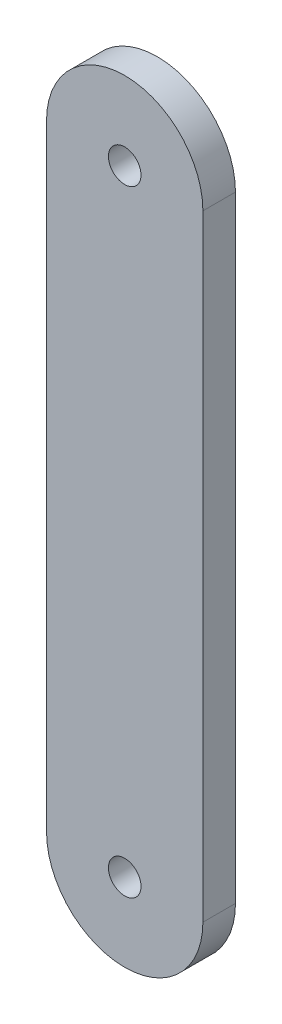
ISO-10303-21;
HEADER;
FILE_DESCRIPTION(('STEP AP214'),'2;1');
FILE_NAME('part.step','',(''),(''),'','','');
FILE_SCHEMA(('AUTOMOTIVE_DESIGN { 1 0 10303 214 1 1 1 1 }'));
ENDSEC;
DATA;
#1=APPLICATION_CONTEXT('core data for automotive mechanical design processes');
#2=APPLICATION_PROTOCOL_DEFINITION('international standard','automotive_design',2000,#1);
#3=PRODUCT_CONTEXT('',#1,'mechanical');
#4=PRODUCT('Part','Part','',(#3));
#5=PRODUCT_RELATED_PRODUCT_CATEGORY('part','',(#4));
#6=PRODUCT_DEFINITION_FORMATION('','',#4);
#7=PRODUCT_DEFINITION_CONTEXT('part definition',#1,'design');
#8=PRODUCT_DEFINITION('design','',#6,#7);
#9=PRODUCT_DEFINITION_SHAPE('','',#8);
#10=(LENGTH_UNIT() NAMED_UNIT(*) SI_UNIT(.MILLI.,.METRE.));
#11=(NAMED_UNIT(*) PLANE_ANGLE_UNIT() SI_UNIT($,.RADIAN.));
#12=(NAMED_UNIT(*) SI_UNIT($,.STERADIAN.) SOLID_ANGLE_UNIT());
#13=UNCERTAINTY_MEASURE_WITH_UNIT(LENGTH_MEASURE(1.E-05),#10,'distance_accuracy_value','');
#14=(GEOMETRIC_REPRESENTATION_CONTEXT(3) GLOBAL_UNCERTAINTY_ASSIGNED_CONTEXT((#13)) GLOBAL_UNIT_ASSIGNED_CONTEXT((#10,
#11,#12)) REPRESENTATION_CONTEXT('',''));
#15=CARTESIAN_POINT('',(0.,0.,0.));
#16=DIRECTION('',(0.,0.,1.));
#17=DIRECTION('',(1.,0.,0.));
#18=AXIS2_PLACEMENT_3D('',#15,#16,#17);
#19=CARTESIAN_POINT('',(0.,-47.2800000000001,0.));
#20=DIRECTION('',(0.,0.,1.));
#21=DIRECTION('',(1.,0.,0.));
#22=AXIS2_PLACEMENT_3D('',#19,#20,#21);
#23=CYLINDRICAL_SURFACE('',#22,12.);
#24=CARTESIAN_POINT('',(0.,-47.2800000000001,5.));
#25=DIRECTION('',(0.,0.,1.));
#26=DIRECTION('',(1.,0.,0.));
#27=AXIS2_PLACEMENT_3D('',#24,#25,#26);
#28=CIRCLE('',#27,12.);
#29=CARTESIAN_POINT('',(-12.,-47.28,5.));
#30=VERTEX_POINT('',#29);
#31=CARTESIAN_POINT('',(12.,-47.28,5.));
#32=VERTEX_POINT('',#31);
#33=EDGE_CURVE('E99',#30,#32,#28,.T.);
#34=ORIENTED_EDGE('',*,*,#33,.F.);
#35=DIRECTION('',(0.,0.,1.));
#36=VECTOR('',#35,1.);
#37=CARTESIAN_POINT('',(-12.,-47.28,0.));
#38=LINE('',#37,#36);
#39=CARTESIAN_POINT('',(-12.,-47.28,0.));
#40=VERTEX_POINT('',#39);
#41=EDGE_CURVE('E11',#40,#30,#38,.T.);
#42=ORIENTED_EDGE('',*,*,#41,.F.);
#43=CARTESIAN_POINT('',(0.,-47.2800000000001,0.));
#44=DIRECTION('',(0.,0.,1.));
#45=DIRECTION('',(1.,0.,0.));
#46=AXIS2_PLACEMENT_3D('',#43,#44,#45);
#47=CIRCLE('',#46,12.);
#48=CARTESIAN_POINT('',(12.,-47.28,0.));
#49=VERTEX_POINT('',#48);
#50=EDGE_CURVE('E92',#40,#49,#47,.T.);
#51=ORIENTED_EDGE('',*,*,#50,.T.);
#52=DIRECTION('',(0.,0.,1.));
#53=VECTOR('',#52,1.);
#54=CARTESIAN_POINT('',(12.,-47.28,0.));
#55=LINE('',#54,#53);
#56=EDGE_CURVE('E37',#49,#32,#55,.T.);
#57=ORIENTED_EDGE('',*,*,#56,.T.);
#58=EDGE_LOOP('',(#34,#42,#51,#57));
#59=FACE_BOUND('',#58,.T.);
#60=ADVANCED_FACE('F34',(#59),#23,.T.);
#61=CARTESIAN_POINT('',(-12.,47.28,0.));
#62=DIRECTION('',(-1.,0.,0.));
#63=DIRECTION('',(0.,0.,1.));
#64=AXIS2_PLACEMENT_3D('',#61,#62,#63);
#65=PLANE('',#64);
#66=DIRECTION('',(0.,-1.,0.));
#67=VECTOR('',#66,1.);
#68=CARTESIAN_POINT('',(-12.,47.28,5.));
#69=LINE('',#68,#67);
#70=CARTESIAN_POINT('',(-12.,47.28,5.));
#71=VERTEX_POINT('',#70);
#72=EDGE_CURVE('E94',#71,#30,#69,.T.);
#73=ORIENTED_EDGE('',*,*,#72,.F.);
#74=DIRECTION('',(0.,0.,1.));
#75=VECTOR('',#74,1.);
#76=CARTESIAN_POINT('',(-12.,47.28,0.));
#77=LINE('',#76,#75);
#78=CARTESIAN_POINT('',(-12.,47.28,0.));
#79=VERTEX_POINT('',#78);
#80=EDGE_CURVE('E43',#79,#71,#77,.T.);
#81=ORIENTED_EDGE('',*,*,#80,.F.);
#82=DIRECTION('',(0.,-1.,0.));
#83=VECTOR('',#82,1.);
#84=CARTESIAN_POINT('',(-12.,47.28,0.));
#85=LINE('',#84,#83);
#86=EDGE_CURVE('E89',#79,#40,#85,.T.);
#87=ORIENTED_EDGE('',*,*,#86,.T.);
#88=ORIENTED_EDGE('',*,*,#41,.T.);
#89=EDGE_LOOP('',(#73,#81,#87,#88));
#90=FACE_BOUND('',#89,.T.);
#91=ADVANCED_FACE('F110',(#90),#65,.T.);
#92=CARTESIAN_POINT('',(0.,47.2800000000001,0.));
#93=DIRECTION('',(0.,0.,1.));
#94=DIRECTION('',(1.,0.,0.));
#95=AXIS2_PLACEMENT_3D('',#92,#93,#94);
#96=CYLINDRICAL_SURFACE('',#95,12.);
#97=CARTESIAN_POINT('',(0.,47.2800000000001,5.));
#98=DIRECTION('',(0.,0.,1.));
#99=DIRECTION('',(1.,0.,0.));
#100=AXIS2_PLACEMENT_3D('',#97,#98,#99);
#101=CIRCLE('',#100,12.);
#102=CARTESIAN_POINT('',(12.,47.2800000000001,5.));
#103=VERTEX_POINT('',#102);
#104=EDGE_CURVE('E84',#103,#71,#101,.T.);
#105=ORIENTED_EDGE('',*,*,#104,.F.);
#106=DIRECTION('',(0.,0.,1.));
#107=VECTOR('',#106,1.);
#108=CARTESIAN_POINT('',(12.,47.2800000000001,0.));
#109=LINE('',#108,#107);
#110=CARTESIAN_POINT('',(12.,47.2800000000001,0.));
#111=VERTEX_POINT('',#110);
#112=EDGE_CURVE('E79',#111,#103,#109,.T.);
#113=ORIENTED_EDGE('',*,*,#112,.F.);
#114=CARTESIAN_POINT('',(0.,47.2800000000001,0.));
#115=DIRECTION('',(0.,0.,1.));
#116=DIRECTION('',(1.,0.,0.));
#117=AXIS2_PLACEMENT_3D('',#114,#115,#116);
#118=CIRCLE('',#117,12.);
#119=EDGE_CURVE('E82',#111,#79,#118,.T.);
#120=ORIENTED_EDGE('',*,*,#119,.T.);
#121=ORIENTED_EDGE('',*,*,#80,.T.);
#122=EDGE_LOOP('',(#105,#113,#120,#121));
#123=FACE_BOUND('',#122,.T.);
#124=ADVANCED_FACE('F81',(#123),#96,.T.);
#125=CARTESIAN_POINT('',(12.,-47.28,0.));
#126=DIRECTION('',(1.,0.,0.));
#127=DIRECTION('',(0.,1.,0.));
#128=AXIS2_PLACEMENT_3D('',#125,#126,#127);
#129=PLANE('',#128);
#130=DIRECTION('',(0.,1.,0.));
#131=VECTOR('',#130,1.);
#132=CARTESIAN_POINT('',(12.,-47.28,5.));
#133=LINE('',#132,#131);
#134=EDGE_CURVE('E102',#32,#103,#133,.T.);
#135=ORIENTED_EDGE('',*,*,#134,.F.);
#136=ORIENTED_EDGE('',*,*,#56,.F.);
#137=DIRECTION('',(0.,1.,0.));
#138=VECTOR('',#137,1.);
#139=CARTESIAN_POINT('',(12.,-47.28,0.));
#140=LINE('',#139,#138);
#141=EDGE_CURVE('E88',#49,#111,#140,.T.);
#142=ORIENTED_EDGE('',*,*,#141,.T.);
#143=ORIENTED_EDGE('',*,*,#112,.T.);
#144=EDGE_LOOP('',(#135,#136,#142,#143));
#145=FACE_BOUND('',#144,.T.);
#146=ADVANCED_FACE('F91',(#145),#129,.T.);
#147=CARTESIAN_POINT('',(0.,-47.2800000000001,0.));
#148=DIRECTION('',(0.,0.,1.));
#149=DIRECTION('',(1.,0.,0.));
#150=AXIS2_PLACEMENT_3D('',#147,#148,#149);
#151=PLANE('',#150);
#152=CARTESIAN_POINT('',(0.,47.2800000000001,0.));
#153=DIRECTION('',(0.,0.,1.));
#154=DIRECTION('',(-1.,0.,0.));
#155=AXIS2_PLACEMENT_3D('',#152,#153,#154);
#156=CIRCLE('',#155,2.5);
#157=CARTESIAN_POINT('',(-2.5,47.2800000000001,0.));
#158=VERTEX_POINT('',#157);
#159=EDGE_CURVE('E143',#158,#158,#156,.T.);
#160=ORIENTED_EDGE('',*,*,#159,.T.);
#161=EDGE_LOOP('',(#160));
#162=FACE_BOUND('',#161,.T.);
#163=CARTESIAN_POINT('',(0.,-47.2800000000001,0.));
#164=DIRECTION('',(0.,0.,1.));
#165=DIRECTION('',(-1.,0.,0.));
#166=AXIS2_PLACEMENT_3D('',#163,#164,#165);
#167=CIRCLE('',#166,2.5);
#168=CARTESIAN_POINT('',(-2.5,-47.2800000000001,0.));
#169=VERTEX_POINT('',#168);
#170=EDGE_CURVE('E103',#169,#169,#167,.T.);
#171=ORIENTED_EDGE('',*,*,#170,.T.);
#172=EDGE_LOOP('',(#171));
#173=FACE_BOUND('',#172,.T.);
#174=ORIENTED_EDGE('',*,*,#50,.F.);
#175=ORIENTED_EDGE('',*,*,#86,.F.);
#176=ORIENTED_EDGE('',*,*,#119,.F.);
#177=ORIENTED_EDGE('',*,*,#141,.F.);
#178=EDGE_LOOP('',(#174,#175,#176,#177));
#179=FACE_BOUND('',#178,.T.);
#180=ADVANCED_FACE('F87',(#162,#173,#179),#151,.F.);
#181=CARTESIAN_POINT('',(0.,-47.2800000000001,5.));
#182=DIRECTION('',(0.,0.,1.));
#183=DIRECTION('',(1.,0.,0.));
#184=AXIS2_PLACEMENT_3D('',#181,#182,#183);
#185=PLANE('',#184);
#186=CARTESIAN_POINT('',(0.,47.2800000000001,5.));
#187=DIRECTION('',(0.,0.,1.));
#188=DIRECTION('',(-1.,0.,0.));
#189=AXIS2_PLACEMENT_3D('',#186,#187,#188);
#190=CIRCLE('',#189,2.5);
#191=CARTESIAN_POINT('',(-2.5,47.2800000000001,5.));
#192=VERTEX_POINT('',#191);
#193=EDGE_CURVE('E146',#192,#192,#190,.T.);
#194=ORIENTED_EDGE('',*,*,#193,.F.);
#195=EDGE_LOOP('',(#194));
#196=FACE_BOUND('',#195,.T.);
#197=CARTESIAN_POINT('',(0.,-47.2800000000001,5.));
#198=DIRECTION('',(0.,0.,1.));
#199=DIRECTION('',(-1.,0.,0.));
#200=AXIS2_PLACEMENT_3D('',#197,#198,#199);
#201=CIRCLE('',#200,2.5);
#202=CARTESIAN_POINT('',(-2.5,-47.2800000000001,5.));
#203=VERTEX_POINT('',#202);
#204=EDGE_CURVE('E148',#203,#203,#201,.T.);
#205=ORIENTED_EDGE('',*,*,#204,.F.);
#206=EDGE_LOOP('',(#205));
#207=FACE_BOUND('',#206,.T.);
#208=ORIENTED_EDGE('',*,*,#33,.T.);
#209=ORIENTED_EDGE('',*,*,#134,.T.);
#210=ORIENTED_EDGE('',*,*,#104,.T.);
#211=ORIENTED_EDGE('',*,*,#72,.T.);
#212=EDGE_LOOP('',(#208,#209,#210,#211));
#213=FACE_BOUND('',#212,.T.);
#214=ADVANCED_FACE('F109',(#196,#207,#213),#185,.T.);
#215=CARTESIAN_POINT('',(0.,-47.2800000000001,0.));
#216=DIRECTION('',(0.,0.,1.));
#217=DIRECTION('',(1.,0.,0.));
#218=AXIS2_PLACEMENT_3D('',#215,#216,#217);
#219=CYLINDRICAL_SURFACE('',#218,2.5);
#220=ORIENTED_EDGE('',*,*,#170,.F.);
#221=EDGE_LOOP('',(#220));
#222=FACE_BOUND('',#221,.T.);
#223=ORIENTED_EDGE('',*,*,#204,.T.);
#224=EDGE_LOOP('',(#223));
#225=FACE_BOUND('',#224,.T.);
#226=ADVANCED_FACE('F128',(#222,#225),#219,.F.);
#227=CARTESIAN_POINT('',(0.,47.2800000000001,0.));
#228=DIRECTION('',(0.,0.,1.));
#229=DIRECTION('',(1.,0.,0.));
#230=AXIS2_PLACEMENT_3D('',#227,#228,#229);
#231=CYLINDRICAL_SURFACE('',#230,2.5);
#232=ORIENTED_EDGE('',*,*,#159,.F.);
#233=EDGE_LOOP('',(#232));
#234=FACE_BOUND('',#233,.T.);
#235=ORIENTED_EDGE('',*,*,#193,.T.);
#236=EDGE_LOOP('',(#235));
#237=FACE_BOUND('',#236,.T.);
#238=ADVANCED_FACE('F135',(#234,#237),#231,.F.);
#239=CLOSED_SHELL('',(#60,#91,#124,#146,#180,#214,#226,#238));
#240=MANIFOLD_SOLID_BREP('B2',#239);
#241=ADVANCED_BREP_SHAPE_REPRESENTATION('',(#18,#240),#14);
#242=SHAPE_DEFINITION_REPRESENTATION(#9,#241);
ENDSEC;
END-ISO-10303-21;
